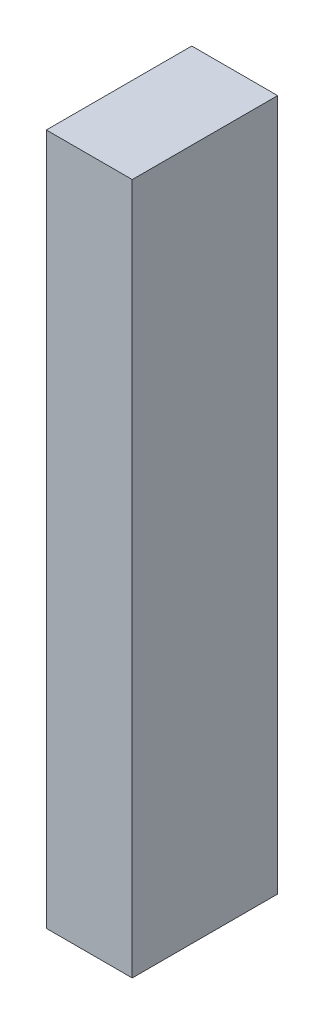
ISO-10303-21;
HEADER;
FILE_DESCRIPTION(('STEP AP214'),'2;1');
FILE_NAME('part.step','',(''),(''),'','','');
FILE_SCHEMA(('AUTOMOTIVE_DESIGN { 1 0 10303 214 1 1 1 1 }'));
ENDSEC;
DATA;
#1=APPLICATION_CONTEXT('core data for automotive mechanical design processes');
#2=APPLICATION_PROTOCOL_DEFINITION('international standard','automotive_design',2000,#1);
#3=PRODUCT_CONTEXT('',#1,'mechanical');
#4=PRODUCT('Part','Part','',(#3));
#5=PRODUCT_RELATED_PRODUCT_CATEGORY('part','',(#4));
#6=PRODUCT_DEFINITION_FORMATION('','',#4);
#7=PRODUCT_DEFINITION_CONTEXT('part definition',#1,'design');
#8=PRODUCT_DEFINITION('design','',#6,#7);
#9=PRODUCT_DEFINITION_SHAPE('','',#8);
#10=(LENGTH_UNIT() NAMED_UNIT(*) SI_UNIT(.MILLI.,.METRE.));
#11=(NAMED_UNIT(*) PLANE_ANGLE_UNIT() SI_UNIT($,.RADIAN.));
#12=(NAMED_UNIT(*) SI_UNIT($,.STERADIAN.) SOLID_ANGLE_UNIT());
#13=UNCERTAINTY_MEASURE_WITH_UNIT(LENGTH_MEASURE(1.E-05),#10,'distance_accuracy_value','');
#14=(GEOMETRIC_REPRESENTATION_CONTEXT(3) GLOBAL_UNCERTAINTY_ASSIGNED_CONTEXT((#13)) GLOBAL_UNIT_ASSIGNED_CONTEXT((#10,
#11,#12)) REPRESENTATION_CONTEXT('',''));
#15=CARTESIAN_POINT('',(0.,0.,0.));
#16=DIRECTION('',(0.,0.,1.));
#17=DIRECTION('',(1.,0.,0.));
#18=AXIS2_PLACEMENT_3D('',#15,#16,#17);
#19=CARTESIAN_POINT('',(-1.27,10.2235,0.));
#20=DIRECTION('',(1.,0.,0.));
#21=DIRECTION('',(0.,0.,-1.));
#22=AXIS2_PLACEMENT_3D('',#19,#20,#21);
#23=PLANE('',#22);
#24=DIRECTION('',(0.,0.,1.));
#25=VECTOR('',#24,1.);
#26=CARTESIAN_POINT('',(-1.27,-10.2235,0.));
#27=LINE('',#26,#25);
#28=CARTESIAN_POINT('',(-1.27,-10.2235,0.));
#29=VERTEX_POINT('',#28);
#30=CARTESIAN_POINT('',(-1.27,-10.2235,4.29999902));
#31=VERTEX_POINT('',#30);
#32=EDGE_CURVE('E20',#29,#31,#27,.T.);
#33=ORIENTED_EDGE('',*,*,#32,.T.);
#34=DIRECTION('',(0.,1.,0.));
#35=VECTOR('',#34,1.);
#36=CARTESIAN_POINT('',(-1.27,-10.2235,4.29999902));
#37=LINE('',#36,#35);
#38=CARTESIAN_POINT('',(-1.27,10.2235,4.29999902));
#39=VERTEX_POINT('',#38);
#40=EDGE_CURVE('E55',#31,#39,#37,.T.);
#41=ORIENTED_EDGE('',*,*,#40,.T.);
#42=DIRECTION('',(0.,0.,-1.));
#43=VECTOR('',#42,1.);
#44=CARTESIAN_POINT('',(-1.27,10.2235,0.));
#45=LINE('',#44,#43);
#46=CARTESIAN_POINT('',(-1.27,10.2235,0.));
#47=VERTEX_POINT('',#46);
#48=EDGE_CURVE('E74',#39,#47,#45,.T.);
#49=ORIENTED_EDGE('',*,*,#48,.T.);
#50=DIRECTION('',(0.,1.,0.));
#51=VECTOR('',#50,1.);
#52=CARTESIAN_POINT('',(-1.27,-10.2235,0.));
#53=LINE('',#52,#51);
#54=EDGE_CURVE('E66',#29,#47,#53,.T.);
#55=ORIENTED_EDGE('',*,*,#54,.F.);
#56=EDGE_LOOP('',(#33,#41,#49,#55));
#57=FACE_BOUND('',#56,.T.);
#58=ADVANCED_FACE('F17',(#57),#23,.F.);
#59=CARTESIAN_POINT('',(-1.27,-10.2235,0.));
#60=DIRECTION('',(0.,1.,0.));
#61=DIRECTION('',(0.,0.,1.));
#62=AXIS2_PLACEMENT_3D('',#59,#60,#61);
#63=PLANE('',#62);
#64=DIRECTION('',(0.,0.,1.));
#65=VECTOR('',#64,1.);
#66=CARTESIAN_POINT('',(1.27,-10.2235,0.));
#67=LINE('',#66,#65);
#68=CARTESIAN_POINT('',(1.27,-10.2235,0.));
#69=VERTEX_POINT('',#68);
#70=CARTESIAN_POINT('',(1.27,-10.2235,4.29999902));
#71=VERTEX_POINT('',#70);
#72=EDGE_CURVE('E72',#69,#71,#67,.T.);
#73=ORIENTED_EDGE('',*,*,#72,.T.);
#74=DIRECTION('',(-1.,0.,0.));
#75=VECTOR('',#74,1.);
#76=CARTESIAN_POINT('',(-1.27,-10.2235,4.29999902));
#77=LINE('',#76,#75);
#78=EDGE_CURVE('E62',#71,#31,#77,.T.);
#79=ORIENTED_EDGE('',*,*,#78,.T.);
#80=ORIENTED_EDGE('',*,*,#32,.F.);
#81=DIRECTION('',(-1.,0.,0.));
#82=VECTOR('',#81,1.);
#83=CARTESIAN_POINT('',(-1.27,-10.2235,0.));
#84=LINE('',#83,#82);
#85=EDGE_CURVE('E80',#69,#29,#84,.T.);
#86=ORIENTED_EDGE('',*,*,#85,.F.);
#87=EDGE_LOOP('',(#73,#79,#80,#86));
#88=FACE_BOUND('',#87,.T.);
#89=ADVANCED_FACE('F71',(#88),#63,.F.);
#90=CARTESIAN_POINT('',(-1.27,-10.2235,4.29999902));
#91=DIRECTION('',(0.,0.,-1.));
#92=DIRECTION('',(-1.,0.,0.));
#93=AXIS2_PLACEMENT_3D('',#90,#91,#92);
#94=PLANE('',#93);
#95=DIRECTION('',(0.,1.,0.));
#96=VECTOR('',#95,1.);
#97=CARTESIAN_POINT('',(1.27,-10.2235,4.29999902));
#98=LINE('',#97,#96);
#99=CARTESIAN_POINT('',(1.27,10.2235,4.29999902));
#100=VERTEX_POINT('',#99);
#101=EDGE_CURVE('E83',#71,#100,#98,.T.);
#102=ORIENTED_EDGE('',*,*,#101,.T.);
#103=DIRECTION('',(1.,0.,0.));
#104=VECTOR('',#103,1.);
#105=CARTESIAN_POINT('',(1.27,10.2235,4.29999902));
#106=LINE('',#105,#104);
#107=EDGE_CURVE('E64',#100,#39,#106,.F.);
#108=ORIENTED_EDGE('',*,*,#107,.T.);
#109=ORIENTED_EDGE('',*,*,#40,.F.);
#110=ORIENTED_EDGE('',*,*,#78,.F.);
#111=EDGE_LOOP('',(#102,#108,#109,#110));
#112=FACE_BOUND('',#111,.T.);
#113=ADVANCED_FACE('F60',(#112),#94,.F.);
#114=CARTESIAN_POINT('',(1.27,10.2235,0.));
#115=DIRECTION('',(0.,-1.,0.));
#116=DIRECTION('',(0.,0.,-1.));
#117=AXIS2_PLACEMENT_3D('',#114,#115,#116);
#118=PLANE('',#117);
#119=ORIENTED_EDGE('',*,*,#48,.F.);
#120=ORIENTED_EDGE('',*,*,#107,.F.);
#121=DIRECTION('',(0.,0.,1.));
#122=VECTOR('',#121,1.);
#123=CARTESIAN_POINT('',(1.27,10.2235,0.));
#124=LINE('',#123,#122);
#125=CARTESIAN_POINT('',(1.27,10.2235,0.));
#126=VERTEX_POINT('',#125);
#127=EDGE_CURVE('E26',#100,#126,#124,.F.);
#128=ORIENTED_EDGE('',*,*,#127,.T.);
#129=DIRECTION('',(-1.,0.,0.));
#130=VECTOR('',#129,1.);
#131=CARTESIAN_POINT('',(-1.27,10.2235,0.));
#132=LINE('',#131,#130);
#133=EDGE_CURVE('E34',#47,#126,#132,.F.);
#134=ORIENTED_EDGE('',*,*,#133,.F.);
#135=EDGE_LOOP('',(#119,#120,#128,#134));
#136=FACE_BOUND('',#135,.T.);
#137=ADVANCED_FACE('F88',(#136),#118,.F.);
#138=CARTESIAN_POINT('',(-1.27,-10.2235,0.));
#139=DIRECTION('',(0.,0.,-1.));
#140=DIRECTION('',(-1.,0.,0.));
#141=AXIS2_PLACEMENT_3D('',#138,#139,#140);
#142=PLANE('',#141);
#143=DIRECTION('',(0.,1.,0.));
#144=VECTOR('',#143,1.);
#145=CARTESIAN_POINT('',(1.27,-10.2235,0.));
#146=LINE('',#145,#144);
#147=EDGE_CURVE('E11',#126,#69,#146,.F.);
#148=ORIENTED_EDGE('',*,*,#147,.T.);
#149=ORIENTED_EDGE('',*,*,#85,.T.);
#150=ORIENTED_EDGE('',*,*,#54,.T.);
#151=ORIENTED_EDGE('',*,*,#133,.T.);
#152=EDGE_LOOP('',(#148,#149,#150,#151));
#153=FACE_BOUND('',#152,.T.);
#154=ADVANCED_FACE('F91',(#153),#142,.T.);
#155=CARTESIAN_POINT('',(1.27,-10.2235,0.));
#156=DIRECTION('',(-1.,0.,0.));
#157=DIRECTION('',(0.,0.,1.));
#158=AXIS2_PLACEMENT_3D('',#155,#156,#157);
#159=PLANE('',#158);
#160=ORIENTED_EDGE('',*,*,#127,.F.);
#161=ORIENTED_EDGE('',*,*,#101,.F.);
#162=ORIENTED_EDGE('',*,*,#72,.F.);
#163=ORIENTED_EDGE('',*,*,#147,.F.);
#164=EDGE_LOOP('',(#160,#161,#162,#163));
#165=FACE_BOUND('',#164,.T.);
#166=ADVANCED_FACE('F90',(#165),#159,.F.);
#167=CLOSED_SHELL('',(#58,#89,#113,#137,#154,#166));
#168=MANIFOLD_SOLID_BREP('B1',#167);
#169=ADVANCED_BREP_SHAPE_REPRESENTATION('',(#18,#168),#14);
#170=SHAPE_DEFINITION_REPRESENTATION(#9,#169);
ENDSEC;
END-ISO-10303-21;
